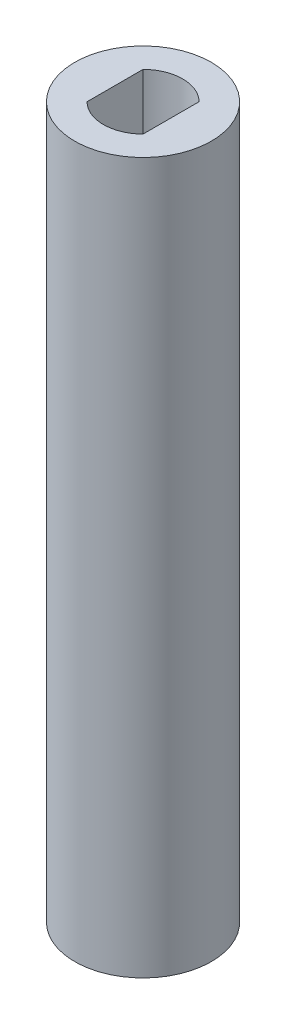
ISO-10303-21;
HEADER;
FILE_DESCRIPTION(('STEP AP214'),'2;1');
FILE_NAME('part.step','',(''),(''),'','','');
FILE_SCHEMA(('AUTOMOTIVE_DESIGN { 1 0 10303 214 1 1 1 1 }'));
ENDSEC;
DATA;
#1=APPLICATION_CONTEXT('core data for automotive mechanical design processes');
#2=APPLICATION_PROTOCOL_DEFINITION('international standard','automotive_design',2000,#1);
#3=PRODUCT_CONTEXT('',#1,'mechanical');
#4=PRODUCT('Part','Part','',(#3));
#5=PRODUCT_RELATED_PRODUCT_CATEGORY('part','',(#4));
#6=PRODUCT_DEFINITION_FORMATION('','',#4);
#7=PRODUCT_DEFINITION_CONTEXT('part definition',#1,'design');
#8=PRODUCT_DEFINITION('design','',#6,#7);
#9=PRODUCT_DEFINITION_SHAPE('','',#8);
#10=(LENGTH_UNIT() NAMED_UNIT(*) SI_UNIT(.MILLI.,.METRE.));
#11=(NAMED_UNIT(*) PLANE_ANGLE_UNIT() SI_UNIT($,.RADIAN.));
#12=(NAMED_UNIT(*) SI_UNIT($,.STERADIAN.) SOLID_ANGLE_UNIT());
#13=UNCERTAINTY_MEASURE_WITH_UNIT(LENGTH_MEASURE(1.E-05),#10,'distance_accuracy_value','');
#14=(GEOMETRIC_REPRESENTATION_CONTEXT(3) GLOBAL_UNCERTAINTY_ASSIGNED_CONTEXT((#13)) GLOBAL_UNIT_ASSIGNED_CONTEXT((#10,
#11,#12)) REPRESENTATION_CONTEXT('',''));
#15=CARTESIAN_POINT('',(0.,0.,0.));
#16=DIRECTION('',(0.,0.,1.));
#17=DIRECTION('',(1.,0.,0.));
#18=AXIS2_PLACEMENT_3D('',#15,#16,#17);
#19=CARTESIAN_POINT('',(0.,52.,0.));
#20=DIRECTION('',(0.,-1.,0.));
#21=DIRECTION('',(0.,0.,-1.));
#22=AXIS2_PLACEMENT_3D('',#19,#20,#21);
#23=CYLINDRICAL_SURFACE('',#22,2.9);
#24=CARTESIAN_POINT('',(0.,0.,0.));
#25=DIRECTION('',(0.,1.,0.));
#26=DIRECTION('',(0.,0.,1.));
#27=AXIS2_PLACEMENT_3D('',#24,#25,#26);
#28=CIRCLE('',#27,2.9);
#29=CARTESIAN_POINT('',(2.05,0.,-2.0512191496766));
#30=VERTEX_POINT('',#29);
#31=CARTESIAN_POINT('',(-2.05,0.,-2.0512191496766));
#32=VERTEX_POINT('',#31);
#33=EDGE_CURVE('E114',#30,#32,#28,.T.);
#34=ORIENTED_EDGE('',*,*,#33,.F.);
#35=DIRECTION('',(0.,-1.,0.));
#36=VECTOR('',#35,1.);
#37=CARTESIAN_POINT('',(2.05,52.,-2.0512191496766));
#38=LINE('',#37,#36);
#39=CARTESIAN_POINT('',(2.05,52.,-2.0512191496766));
#40=VERTEX_POINT('',#39);
#41=EDGE_CURVE('E11',#40,#30,#38,.T.);
#42=ORIENTED_EDGE('',*,*,#41,.F.);
#43=CARTESIAN_POINT('',(0.,52.,0.));
#44=DIRECTION('',(0.,1.,0.));
#45=DIRECTION('',(0.,0.,1.));
#46=AXIS2_PLACEMENT_3D('',#43,#44,#45);
#47=CIRCLE('',#46,2.9);
#48=CARTESIAN_POINT('',(-2.05,52.,-2.0512191496766));
#49=VERTEX_POINT('',#48);
#50=EDGE_CURVE('E91',#40,#49,#47,.T.);
#51=ORIENTED_EDGE('',*,*,#50,.T.);
#52=DIRECTION('',(0.,-1.,0.));
#53=VECTOR('',#52,1.);
#54=CARTESIAN_POINT('',(-2.05,52.,-2.0512191496766));
#55=LINE('',#54,#53);
#56=EDGE_CURVE('E58',#49,#32,#55,.T.);
#57=ORIENTED_EDGE('',*,*,#56,.T.);
#58=EDGE_LOOP('',(#34,#42,#51,#57));
#59=FACE_BOUND('',#58,.T.);
#60=ADVANCED_FACE('F41',(#59),#23,.F.);
#61=CARTESIAN_POINT('',(2.05,52.,0.));
#62=DIRECTION('',(1.,0.,0.));
#63=DIRECTION('',(0.,0.,-1.));
#64=AXIS2_PLACEMENT_3D('',#61,#62,#63);
#65=PLANE('',#64);
#66=DIRECTION('',(0.,0.,1.));
#67=VECTOR('',#66,1.);
#68=CARTESIAN_POINT('',(2.05,0.,0.));
#69=LINE('',#68,#67);
#70=CARTESIAN_POINT('',(2.05,0.,2.0512191496766));
#71=VERTEX_POINT('',#70);
#72=EDGE_CURVE('E98',#30,#71,#69,.T.);
#73=ORIENTED_EDGE('',*,*,#72,.T.);
#74=DIRECTION('',(0.,-1.,0.));
#75=VECTOR('',#74,1.);
#76=CARTESIAN_POINT('',(2.05,52.,2.0512191496766));
#77=LINE('',#76,#75);
#78=CARTESIAN_POINT('',(2.05,52.,2.0512191496766));
#79=VERTEX_POINT('',#78);
#80=EDGE_CURVE('E50',#79,#71,#77,.T.);
#81=ORIENTED_EDGE('',*,*,#80,.F.);
#82=DIRECTION('',(0.,0.,1.));
#83=VECTOR('',#82,1.);
#84=CARTESIAN_POINT('',(2.05,52.,0.));
#85=LINE('',#84,#83);
#86=EDGE_CURVE('E84',#40,#79,#85,.T.);
#87=ORIENTED_EDGE('',*,*,#86,.F.);
#88=ORIENTED_EDGE('',*,*,#41,.T.);
#89=EDGE_LOOP('',(#73,#81,#87,#88));
#90=FACE_BOUND('',#89,.T.);
#91=ADVANCED_FACE('F96',(#90),#65,.F.);
#92=CARTESIAN_POINT('',(0.,52.,0.));
#93=DIRECTION('',(0.,-1.,0.));
#94=DIRECTION('',(0.,0.,-1.));
#95=AXIS2_PLACEMENT_3D('',#92,#93,#94);
#96=CYLINDRICAL_SURFACE('',#95,2.9);
#97=CARTESIAN_POINT('',(0.,0.,0.));
#98=DIRECTION('',(0.,1.,0.));
#99=DIRECTION('',(0.,0.,1.));
#100=AXIS2_PLACEMENT_3D('',#97,#98,#99);
#101=CIRCLE('',#100,2.9);
#102=CARTESIAN_POINT('',(-2.05,0.,2.0512191496766));
#103=VERTEX_POINT('',#102);
#104=EDGE_CURVE('E119',#103,#71,#101,.T.);
#105=ORIENTED_EDGE('',*,*,#104,.F.);
#106=DIRECTION('',(0.,-1.,0.));
#107=VECTOR('',#106,1.);
#108=CARTESIAN_POINT('',(-2.05,52.,2.0512191496766));
#109=LINE('',#108,#107);
#110=CARTESIAN_POINT('',(-2.05,52.,2.0512191496766));
#111=VERTEX_POINT('',#110);
#112=EDGE_CURVE('E71',#111,#103,#109,.T.);
#113=ORIENTED_EDGE('',*,*,#112,.F.);
#114=CARTESIAN_POINT('',(0.,52.,0.));
#115=DIRECTION('',(0.,1.,0.));
#116=DIRECTION('',(0.,0.,1.));
#117=AXIS2_PLACEMENT_3D('',#114,#115,#116);
#118=CIRCLE('',#117,2.9);
#119=EDGE_CURVE('E90',#111,#79,#118,.T.);
#120=ORIENTED_EDGE('',*,*,#119,.T.);
#121=ORIENTED_EDGE('',*,*,#80,.T.);
#122=EDGE_LOOP('',(#105,#113,#120,#121));
#123=FACE_BOUND('',#122,.T.);
#124=ADVANCED_FACE('F102',(#123),#96,.F.);
#125=CARTESIAN_POINT('',(-2.05,52.,0.));
#126=DIRECTION('',(1.,0.,0.));
#127=DIRECTION('',(0.,0.,-1.));
#128=AXIS2_PLACEMENT_3D('',#125,#126,#127);
#129=PLANE('',#128);
#130=DIRECTION('',(0.,0.,1.));
#131=VECTOR('',#130,1.);
#132=CARTESIAN_POINT('',(-2.05,0.,0.));
#133=LINE('',#132,#131);
#134=EDGE_CURVE('E122',#32,#103,#133,.T.);
#135=ORIENTED_EDGE('',*,*,#134,.F.);
#136=ORIENTED_EDGE('',*,*,#56,.F.);
#137=DIRECTION('',(0.,0.,1.));
#138=VECTOR('',#137,1.);
#139=CARTESIAN_POINT('',(-2.05,52.,0.));
#140=LINE('',#139,#138);
#141=EDGE_CURVE('E104',#49,#111,#140,.T.);
#142=ORIENTED_EDGE('',*,*,#141,.T.);
#143=ORIENTED_EDGE('',*,*,#112,.T.);
#144=EDGE_LOOP('',(#135,#136,#142,#143));
#145=FACE_BOUND('',#144,.T.);
#146=ADVANCED_FACE('F136',(#145),#129,.T.);
#147=CARTESIAN_POINT('',(0.,52.,0.));
#148=DIRECTION('',(0.,-1.,0.));
#149=DIRECTION('',(0.,0.,-1.));
#150=AXIS2_PLACEMENT_3D('',#147,#148,#149);
#151=CYLINDRICAL_SURFACE('',#150,5.);
#152=CARTESIAN_POINT('',(0.,52.,0.));
#153=DIRECTION('',(0.,1.,0.));
#154=DIRECTION('',(0.,0.,1.));
#155=AXIS2_PLACEMENT_3D('',#152,#153,#154);
#156=CIRCLE('',#155,5.);
#157=CARTESIAN_POINT('',(0.,52.,-5.));
#158=VERTEX_POINT('',#157);
#159=EDGE_CURVE('E107',#158,#158,#156,.T.);
#160=CARTESIAN_POINT('',(0.,0.,0.));
#161=DIRECTION('',(0.,1.,0.));
#162=DIRECTION('',(0.,0.,1.));
#163=AXIS2_PLACEMENT_3D('',#160,#161,#162);
#164=CIRCLE('',#163,5.);
#165=CARTESIAN_POINT('',(0.,0.,-5.));
#166=VERTEX_POINT('',#165);
#167=EDGE_CURVE('E126',#166,#166,#164,.T.);
#168=CARTESIAN_POINT('',(0.,52.,-5.));
#169=CARTESIAN_POINT('',(0.,51.4583333333333,-5.));
#170=CARTESIAN_POINT('',(0.,50.9166666666667,-5.));
#171=CARTESIAN_POINT('',(0.,49.8333333333333,-5.));
#172=CARTESIAN_POINT('',(0.,49.2916666666667,-5.));
#173=CARTESIAN_POINT('',(0.,48.2083333333333,-5.));
#174=CARTESIAN_POINT('',(0.,47.6666666666667,-5.));
#175=CARTESIAN_POINT('',(0.,46.5833333333333,-5.));
#176=CARTESIAN_POINT('',(0.,46.0416666666667,-5.));
#177=CARTESIAN_POINT('',(0.,44.9583333333333,-5.));
#178=CARTESIAN_POINT('',(0.,44.4166666666667,-5.));
#179=CARTESIAN_POINT('',(0.,43.3333333333333,-5.));
#180=CARTESIAN_POINT('',(0.,42.7916666666667,-5.));
#181=CARTESIAN_POINT('',(0.,41.7083333333333,-5.));
#182=CARTESIAN_POINT('',(0.,41.1666666666667,-5.));
#183=CARTESIAN_POINT('',(0.,40.0833333333333,-5.));
#184=CARTESIAN_POINT('',(0.,39.5416666666667,-5.));
#185=CARTESIAN_POINT('',(0.,38.4583333333333,-5.));
#186=CARTESIAN_POINT('',(0.,37.9166666666667,-5.));
#187=CARTESIAN_POINT('',(0.,36.8333333333333,-5.));
#188=CARTESIAN_POINT('',(0.,36.2916666666667,-5.));
#189=CARTESIAN_POINT('',(0.,35.2083333333333,-5.));
#190=CARTESIAN_POINT('',(0.,34.6666666666667,-5.));
#191=CARTESIAN_POINT('',(0.,33.5833333333333,-5.));
#192=CARTESIAN_POINT('',(0.,33.0416666666667,-5.));
#193=CARTESIAN_POINT('',(0.,31.9583333333333,-5.));
#194=CARTESIAN_POINT('',(0.,31.4166666666667,-5.));
#195=CARTESIAN_POINT('',(0.,30.3333333333333,-5.));
#196=CARTESIAN_POINT('',(0.,29.7916666666667,-5.));
#197=CARTESIAN_POINT('',(0.,28.7083333333333,-5.));
#198=CARTESIAN_POINT('',(0.,28.1666666666667,-5.));
#199=CARTESIAN_POINT('',(0.,27.0833333333333,-5.));
#200=CARTESIAN_POINT('',(0.,26.5416666666667,-5.));
#201=CARTESIAN_POINT('',(0.,25.4583333333333,-5.));
#202=CARTESIAN_POINT('',(0.,24.9166666666667,-5.));
#203=CARTESIAN_POINT('',(0.,23.8333333333333,-5.));
#204=CARTESIAN_POINT('',(0.,23.2916666666667,-5.));
#205=CARTESIAN_POINT('',(0.,22.2083333333333,-5.));
#206=CARTESIAN_POINT('',(0.,21.6666666666667,-5.));
#207=CARTESIAN_POINT('',(0.,20.5833333333333,-5.));
#208=CARTESIAN_POINT('',(0.,20.0416666666667,-5.));
#209=CARTESIAN_POINT('',(0.,18.9583333333333,-5.));
#210=CARTESIAN_POINT('',(0.,18.4166666666667,-5.));
#211=CARTESIAN_POINT('',(0.,17.3333333333333,-5.));
#212=CARTESIAN_POINT('',(0.,16.7916666666667,-5.));
#213=CARTESIAN_POINT('',(0.,15.7083333333333,-5.));
#214=CARTESIAN_POINT('',(0.,15.1666666666667,-5.));
#215=CARTESIAN_POINT('',(0.,14.0833333333333,-5.));
#216=CARTESIAN_POINT('',(0.,13.5416666666667,-5.));
#217=CARTESIAN_POINT('',(0.,12.4583333333333,-5.));
#218=CARTESIAN_POINT('',(0.,11.9166666666667,-5.));
#219=CARTESIAN_POINT('',(0.,10.8333333333333,-5.));
#220=CARTESIAN_POINT('',(0.,10.2916666666667,-5.));
#221=CARTESIAN_POINT('',(0.,9.20833333333333,-5.));
#222=CARTESIAN_POINT('',(0.,8.66666666666667,-5.));
#223=CARTESIAN_POINT('',(0.,7.58333333333333,-5.));
#224=CARTESIAN_POINT('',(0.,7.04166666666667,-5.));
#225=CARTESIAN_POINT('',(0.,5.95833333333333,-5.));
#226=CARTESIAN_POINT('',(0.,5.41666666666667,-5.));
#227=CARTESIAN_POINT('',(0.,4.33333333333333,-5.));
#228=CARTESIAN_POINT('',(0.,3.79166666666667,-5.));
#229=CARTESIAN_POINT('',(0.,2.70833333333334,-5.));
#230=CARTESIAN_POINT('',(0.,2.16666666666667,-5.));
#231=CARTESIAN_POINT('',(0.,1.08333333333333,-5.));
#232=CARTESIAN_POINT('',(0.,0.541666666666667,-5.));
#233=CARTESIAN_POINT('',(0.,0.,-5.));
#234=B_SPLINE_CURVE_WITH_KNOTS('',3,(#168,#169,#170,#171,#172,#173,#174,#175,#176,#177,#178,
#179,#180,#181,#182,#183,#184,#185,#186,#187,#188,#189,#190,#191,#192,#193,#194,#195,#196,#197,
#198,#199,#200,#201,#202,#203,#204,#205,#206,#207,#208,#209,#210,#211,#212,#213,#214,#215,#216,
#217,#218,#219,#220,#221,#222,#223,#224,#225,#226,#227,#228,#229,#230,#231,#232,#233),
.UNSPECIFIED.,.F.,.F.,(4,2,2,2,2,2,2,2,2,2,2,2,2,2,2,2,2,2,2,2,2,2,2,2,2,2,2,2,2,2,2,2,4),(0.,
1.625,3.25,4.875,6.50000000000001,8.125,9.75,11.375,13.,14.625,16.25,17.875,19.5,21.125,22.75,
24.375,26.,27.625,29.25,30.875,32.5,34.125,35.75,37.375,39.,40.625,42.25,43.875,45.5,47.125,
48.75,50.375,52.),.UNSPECIFIED.);
#235=EDGE_CURVE('BSEAM138',#158,#166,#234,.T.);
#236=ORIENTED_EDGE('',*,*,#159,.F.);
#237=ORIENTED_EDGE('',*,*,#167,.T.);
#238=ORIENTED_EDGE('',*,*,#235,.T.);
#239=ORIENTED_EDGE('',*,*,#235,.F.);
#240=EDGE_LOOP('',(#236,#238,#237,#239));
#241=FACE_BOUND('',#240,.T.);
#242=ADVANCED_FACE('F138',(#241),#151,.T.);
#243=CARTESIAN_POINT('',(0.,52.,0.));
#244=DIRECTION('',(0.,1.,0.));
#245=DIRECTION('',(0.,0.,1.));
#246=AXIS2_PLACEMENT_3D('',#243,#244,#245);
#247=PLANE('',#246);
#248=ORIENTED_EDGE('',*,*,#50,.F.);
#249=ORIENTED_EDGE('',*,*,#86,.T.);
#250=ORIENTED_EDGE('',*,*,#119,.F.);
#251=ORIENTED_EDGE('',*,*,#141,.F.);
#252=EDGE_LOOP('',(#248,#249,#250,#251));
#253=FACE_BOUND('',#252,.T.);
#254=ORIENTED_EDGE('',*,*,#159,.T.);
#255=EDGE_LOOP('',(#254));
#256=FACE_BOUND('',#255,.T.);
#257=ADVANCED_FACE('F86',(#253,#256),#247,.T.);
#258=CARTESIAN_POINT('',(0.,0.,0.));
#259=DIRECTION('',(0.,1.,0.));
#260=DIRECTION('',(0.,0.,1.));
#261=AXIS2_PLACEMENT_3D('',#258,#259,#260);
#262=PLANE('',#261);
#263=ORIENTED_EDGE('',*,*,#33,.T.);
#264=ORIENTED_EDGE('',*,*,#134,.T.);
#265=ORIENTED_EDGE('',*,*,#104,.T.);
#266=ORIENTED_EDGE('',*,*,#72,.F.);
#267=EDGE_LOOP('',(#263,#264,#265,#266));
#268=FACE_BOUND('',#267,.T.);
#269=ORIENTED_EDGE('',*,*,#167,.F.);
#270=EDGE_LOOP('',(#269));
#271=FACE_BOUND('',#270,.T.);
#272=ADVANCED_FACE('F176',(#268,#271),#262,.F.);
#273=CLOSED_SHELL('',(#60,#91,#124,#146,#242,#257,#272));
#274=MANIFOLD_SOLID_BREP('B2',#273);
#275=ADVANCED_BREP_SHAPE_REPRESENTATION('',(#18,#274),#14);
#276=SHAPE_DEFINITION_REPRESENTATION(#9,#275);
ENDSEC;
END-ISO-10303-21;
